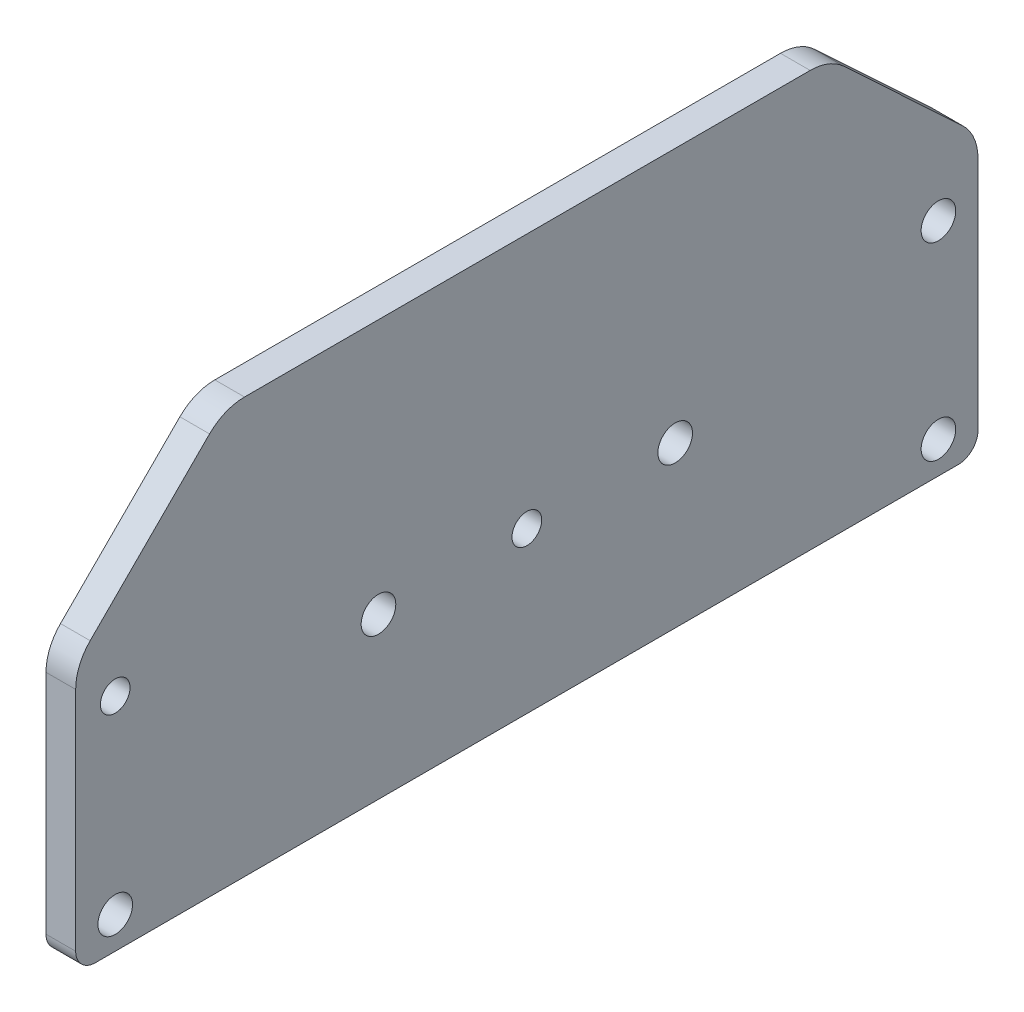
ISO-10303-21;
HEADER;
FILE_DESCRIPTION(('STEP AP214'),'2;1');
FILE_NAME('part.step','',(''),(''),'','','');
FILE_SCHEMA(('AUTOMOTIVE_DESIGN { 1 0 10303 214 1 1 1 1 }'));
ENDSEC;
DATA;
#1=APPLICATION_CONTEXT('core data for automotive mechanical design processes');
#2=APPLICATION_PROTOCOL_DEFINITION('international standard','automotive_design',2000,#1);
#3=PRODUCT_CONTEXT('',#1,'mechanical');
#4=PRODUCT('Part','Part','',(#3));
#5=PRODUCT_RELATED_PRODUCT_CATEGORY('part','',(#4));
#6=PRODUCT_DEFINITION_FORMATION('','',#4);
#7=PRODUCT_DEFINITION_CONTEXT('part definition',#1,'design');
#8=PRODUCT_DEFINITION('design','',#6,#7);
#9=PRODUCT_DEFINITION_SHAPE('','',#8);
#10=(LENGTH_UNIT() NAMED_UNIT(*) SI_UNIT(.MILLI.,.METRE.));
#11=(NAMED_UNIT(*) PLANE_ANGLE_UNIT() SI_UNIT($,.RADIAN.));
#12=(NAMED_UNIT(*) SI_UNIT($,.STERADIAN.) SOLID_ANGLE_UNIT());
#13=UNCERTAINTY_MEASURE_WITH_UNIT(LENGTH_MEASURE(1.E-05),#10,'distance_accuracy_value','');
#14=(GEOMETRIC_REPRESENTATION_CONTEXT(3) GLOBAL_UNCERTAINTY_ASSIGNED_CONTEXT((#13)) GLOBAL_UNIT_ASSIGNED_CONTEXT((#10,
#11,#12)) REPRESENTATION_CONTEXT('',''));
#15=CARTESIAN_POINT('',(0.,0.,0.));
#16=DIRECTION('',(0.,0.,1.));
#17=DIRECTION('',(1.,0.,0.));
#18=AXIS2_PLACEMENT_3D('',#15,#16,#17);
#19=CARTESIAN_POINT('',(30.,20.,-20.));
#20=DIRECTION('',(-1.,0.,0.));
#21=DIRECTION('',(0.,0.,1.));
#22=AXIS2_PLACEMENT_3D('',#19,#20,#21);
#23=CYLINDRICAL_SURFACE('',#22,20.);
#24=CARTESIAN_POINT('',(0.,20.,-20.));
#25=DIRECTION('',(1.,0.,0.));
#26=DIRECTION('',(0.,0.,-1.));
#27=AXIS2_PLACEMENT_3D('',#24,#25,#26);
#28=CIRCLE('',#27,20.);
#29=CARTESIAN_POINT('',(0.,20.0000000000001,0.));
#30=VERTEX_POINT('',#29);
#31=CARTESIAN_POINT('',(0.,0.,-20.0000000000001));
#32=VERTEX_POINT('',#31);
#33=EDGE_CURVE('E201',#30,#32,#28,.T.);
#34=ORIENTED_EDGE('',*,*,#33,.T.);
#35=DIRECTION('',(-1.,0.,0.));
#36=VECTOR('',#35,1.);
#37=CARTESIAN_POINT('',(30.,0.,-20.0000000000001));
#38=LINE('',#37,#36);
#39=CARTESIAN_POINT('',(30.,0.,-20.0000000000001));
#40=VERTEX_POINT('',#39);
#41=EDGE_CURVE('E11',#40,#32,#38,.T.);
#42=ORIENTED_EDGE('',*,*,#41,.F.);
#43=CARTESIAN_POINT('',(30.,20.,-20.));
#44=DIRECTION('',(1.,0.,0.));
#45=DIRECTION('',(0.,0.,-1.));
#46=AXIS2_PLACEMENT_3D('',#43,#44,#45);
#47=CIRCLE('',#46,20.);
#48=CARTESIAN_POINT('',(30.,20.0000000000001,0.));
#49=VERTEX_POINT('',#48);
#50=EDGE_CURVE('E114',#49,#40,#47,.T.);
#51=ORIENTED_EDGE('',*,*,#50,.F.);
#52=DIRECTION('',(-1.,0.,0.));
#53=VECTOR('',#52,1.);
#54=CARTESIAN_POINT('',(30.,20.0000000000001,0.));
#55=LINE('',#54,#53);
#56=EDGE_CURVE('E65',#49,#30,#55,.T.);
#57=ORIENTED_EDGE('',*,*,#56,.T.);
#58=EDGE_LOOP('',(#34,#42,#51,#57));
#59=FACE_BOUND('',#58,.T.);
#60=ADVANCED_FACE('F47',(#59),#23,.T.);
#61=CARTESIAN_POINT('',(30.,0.,0.));
#62=DIRECTION('',(0.,-1.,0.));
#63=DIRECTION('',(0.,0.,-1.));
#64=AXIS2_PLACEMENT_3D('',#61,#62,#63);
#65=PLANE('',#64);
#66=DIRECTION('',(0.,0.,1.));
#67=VECTOR('',#66,1.);
#68=CARTESIAN_POINT('',(0.,0.,0.));
#69=LINE('',#68,#67);
#70=CARTESIAN_POINT('',(0.,-1.00613961606655E-13,-892.32));
#71=VERTEX_POINT('',#70);
#72=EDGE_CURVE('E204',#71,#32,#69,.T.);
#73=ORIENTED_EDGE('',*,*,#72,.F.);
#74=DIRECTION('',(-1.,0.,0.));
#75=VECTOR('',#74,1.);
#76=CARTESIAN_POINT('',(30.,-1.00613961606655E-13,-892.32));
#77=LINE('',#76,#75);
#78=CARTESIAN_POINT('',(30.,-1.00613961606655E-13,-892.32));
#79=VERTEX_POINT('',#78);
#80=EDGE_CURVE('E57',#79,#71,#77,.T.);
#81=ORIENTED_EDGE('',*,*,#80,.F.);
#82=DIRECTION('',(0.,0.,1.));
#83=VECTOR('',#82,1.);
#84=CARTESIAN_POINT('',(30.,0.,0.));
#85=LINE('',#84,#83);
#86=EDGE_CURVE('E300',#79,#40,#85,.T.);
#87=ORIENTED_EDGE('',*,*,#86,.T.);
#88=ORIENTED_EDGE('',*,*,#41,.T.);
#89=EDGE_LOOP('',(#73,#81,#87,#88));
#90=FACE_BOUND('',#89,.T.);
#91=ADVANCED_FACE('F287',(#90),#65,.T.);
#92=CARTESIAN_POINT('',(30.,20.,-892.32));
#93=DIRECTION('',(-1.,0.,0.));
#94=DIRECTION('',(0.,0.,1.));
#95=AXIS2_PLACEMENT_3D('',#92,#93,#94);
#96=CYLINDRICAL_SURFACE('',#95,20.0000000000001);
#97=CARTESIAN_POINT('',(0.,20.,-892.32));
#98=DIRECTION('',(1.,0.,0.));
#99=DIRECTION('',(0.,0.,-1.));
#100=AXIS2_PLACEMENT_3D('',#97,#98,#99);
#101=CIRCLE('',#100,20.0000000000001);
#102=CARTESIAN_POINT('',(0.,20.,-912.32));
#103=VERTEX_POINT('',#102);
#104=EDGE_CURVE('E208',#103,#71,#101,.F.);
#105=ORIENTED_EDGE('',*,*,#104,.F.);
#106=DIRECTION('',(-1.,0.,0.));
#107=VECTOR('',#106,1.);
#108=CARTESIAN_POINT('',(30.,20.,-912.32));
#109=LINE('',#108,#107);
#110=CARTESIAN_POINT('',(30.,20.,-912.32));
#111=VERTEX_POINT('',#110);
#112=EDGE_CURVE('E275',#111,#103,#109,.T.);
#113=ORIENTED_EDGE('',*,*,#112,.F.);
#114=CARTESIAN_POINT('',(30.,20.,-892.32));
#115=DIRECTION('',(1.,0.,0.));
#116=DIRECTION('',(0.,0.,-1.));
#117=AXIS2_PLACEMENT_3D('',#114,#115,#116);
#118=CIRCLE('',#117,20.0000000000001);
#119=EDGE_CURVE('E284',#111,#79,#118,.F.);
#120=ORIENTED_EDGE('',*,*,#119,.T.);
#121=ORIENTED_EDGE('',*,*,#80,.T.);
#122=EDGE_LOOP('',(#105,#113,#120,#121));
#123=FACE_BOUND('',#122,.T.);
#124=ADVANCED_FACE('F282',(#123),#96,.T.);
#125=CARTESIAN_POINT('',(30.,0.,-912.32));
#126=DIRECTION('',(0.,0.,-1.));
#127=DIRECTION('',(-1.,0.,0.));
#128=AXIS2_PLACEMENT_3D('',#125,#126,#127);
#129=PLANE('',#128);
#130=DIRECTION('',(0.,-1.,0.));
#131=VECTOR('',#130,1.);
#132=CARTESIAN_POINT('',(0.,0.,-912.32));
#133=LINE('',#132,#131);
#134=CARTESIAN_POINT('',(0.,258.27238490439,-912.32));
#135=VERTEX_POINT('',#134);
#136=EDGE_CURVE('E212',#135,#103,#133,.T.);
#137=ORIENTED_EDGE('',*,*,#136,.F.);
#138=DIRECTION('',(-1.,0.,0.));
#139=VECTOR('',#138,1.);
#140=CARTESIAN_POINT('',(30.,258.27238490439,-912.32));
#141=LINE('',#140,#139);
#142=CARTESIAN_POINT('',(30.,258.27238490439,-912.32));
#143=VERTEX_POINT('',#142);
#144=EDGE_CURVE('E272',#143,#135,#141,.T.);
#145=ORIENTED_EDGE('',*,*,#144,.F.);
#146=DIRECTION('',(0.,-1.,0.));
#147=VECTOR('',#146,1.);
#148=CARTESIAN_POINT('',(30.,0.,-912.32));
#149=LINE('',#148,#147);
#150=EDGE_CURVE('E297',#143,#111,#149,.T.);
#151=ORIENTED_EDGE('',*,*,#150,.T.);
#152=ORIENTED_EDGE('',*,*,#112,.T.);
#153=EDGE_LOOP('',(#137,#145,#151,#152));
#154=FACE_BOUND('',#153,.T.);
#155=ADVANCED_FACE('F294',(#154),#129,.T.);
#156=CARTESIAN_POINT('',(30.,258.27238490439,-862.32));
#157=DIRECTION('',(-1.,0.,0.));
#158=DIRECTION('',(0.,0.,1.));
#159=AXIS2_PLACEMENT_3D('',#156,#157,#158);
#160=CYLINDRICAL_SURFACE('',#159,50.);
#161=CARTESIAN_POINT('',(0.,258.27238490439,-862.32));
#162=DIRECTION('',(1.,0.,0.));
#163=DIRECTION('',(0.,0.,-1.));
#164=AXIS2_PLACEMENT_3D('',#161,#162,#163);
#165=CIRCLE('',#164,50.);
#166=CARTESIAN_POINT('',(0.,294.825148316533,-896.435912518001));
#167=VERTEX_POINT('',#166);
#168=EDGE_CURVE('E216',#167,#135,#165,.F.);
#169=ORIENTED_EDGE('',*,*,#168,.F.);
#170=DIRECTION('',(-1.,0.,0.));
#171=VECTOR('',#170,1.);
#172=CARTESIAN_POINT('',(30.,294.825148316533,-896.435912518001));
#173=LINE('',#172,#171);
#174=CARTESIAN_POINT('',(30.,294.825148316533,-896.435912518001));
#175=VERTEX_POINT('',#174);
#176=EDGE_CURVE('E269',#175,#167,#173,.T.);
#177=ORIENTED_EDGE('',*,*,#176,.F.);
#178=CARTESIAN_POINT('',(30.,258.27238490439,-862.32));
#179=DIRECTION('',(1.,0.,0.));
#180=DIRECTION('',(0.,0.,-1.));
#181=AXIS2_PLACEMENT_3D('',#178,#179,#180);
#182=CIRCLE('',#181,50.);
#183=EDGE_CURVE('E305',#175,#143,#182,.F.);
#184=ORIENTED_EDGE('',*,*,#183,.T.);
#185=ORIENTED_EDGE('',*,*,#144,.T.);
#186=EDGE_LOOP('',(#169,#177,#184,#185));
#187=FACE_BOUND('',#186,.T.);
#188=ADVANCED_FACE('F538',(#187),#160,.T.);
#189=CARTESIAN_POINT('',(30.,604.720190023753,-564.405510688838));
#190=DIRECTION('',(0.,0.731055268242868,-0.682318250360012));
#191=DIRECTION('',(0.,0.682318250360012,0.731055268242868));
#192=AXIS2_PLACEMENT_3D('',#189,#190,#191);
#193=PLANE('',#192);
#194=DIRECTION('',(0.,-0.682318250360012,-0.731055268242868));
#195=VECTOR('',#194,1.);
#196=CARTESIAN_POINT('',(0.,604.720190023753,-564.405510688838));
#197=LINE('',#196,#195);
#198=CARTESIAN_POINT('',(0.,406.552763412144,-776.727753486989));
#199=VERTEX_POINT('',#198);
#200=EDGE_CURVE('E220',#199,#167,#197,.T.);
#201=ORIENTED_EDGE('',*,*,#200,.F.);
#202=DIRECTION('',(-1.,0.,0.));
#203=VECTOR('',#202,1.);
#204=CARTESIAN_POINT('',(30.,406.552763412144,-776.727753486989));
#205=LINE('',#204,#203);
#206=CARTESIAN_POINT('',(30.,406.552763412144,-776.727753486989));
#207=VERTEX_POINT('',#206);
#208=EDGE_CURVE('E266',#207,#199,#205,.T.);
#209=ORIENTED_EDGE('',*,*,#208,.F.);
#210=DIRECTION('',(0.,-0.682318250360012,-0.731055268242868));
#211=VECTOR('',#210,1.);
#212=CARTESIAN_POINT('',(30.,604.720190023753,-564.405510688838));
#213=LINE('',#212,#211);
#214=EDGE_CURVE('E312',#207,#175,#213,.T.);
#215=ORIENTED_EDGE('',*,*,#214,.T.);
#216=ORIENTED_EDGE('',*,*,#176,.T.);
#217=EDGE_LOOP('',(#201,#209,#215,#216));
#218=FACE_BOUND('',#217,.T.);
#219=ADVANCED_FACE('F529',(#218),#193,.T.);
#220=CARTESIAN_POINT('',(30.,370.000000000001,-742.611840968988));
#221=DIRECTION('',(-1.,0.,0.));
#222=DIRECTION('',(0.,0.,1.));
#223=AXIS2_PLACEMENT_3D('',#220,#221,#222);
#224=CYLINDRICAL_SURFACE('',#223,50.);
#225=CARTESIAN_POINT('',(0.,370.000000000001,-742.611840968988));
#226=DIRECTION('',(1.,0.,0.));
#227=DIRECTION('',(0.,0.,-1.));
#228=AXIS2_PLACEMENT_3D('',#225,#226,#227);
#229=CIRCLE('',#228,50.);
#230=CARTESIAN_POINT('',(0.,420.000000000001,-742.611840968988));
#231=VERTEX_POINT('',#230);
#232=EDGE_CURVE('E224',#231,#199,#229,.F.);
#233=ORIENTED_EDGE('',*,*,#232,.F.);
#234=DIRECTION('',(-1.,0.,0.));
#235=VECTOR('',#234,1.);
#236=CARTESIAN_POINT('',(30.,420.000000000001,-742.611840968988));
#237=LINE('',#236,#235);
#238=CARTESIAN_POINT('',(30.,420.000000000001,-742.611840968988));
#239=VERTEX_POINT('',#238);
#240=EDGE_CURVE('E263',#239,#231,#237,.T.);
#241=ORIENTED_EDGE('',*,*,#240,.F.);
#242=CARTESIAN_POINT('',(30.,370.000000000001,-742.611840968988));
#243=DIRECTION('',(1.,0.,0.));
#244=DIRECTION('',(0.,0.,-1.));
#245=AXIS2_PLACEMENT_3D('',#242,#243,#244);
#246=CIRCLE('',#245,50.);
#247=EDGE_CURVE('E316',#239,#207,#246,.F.);
#248=ORIENTED_EDGE('',*,*,#247,.T.);
#249=ORIENTED_EDGE('',*,*,#208,.T.);
#250=EDGE_LOOP('',(#233,#241,#248,#249));
#251=FACE_BOUND('',#250,.T.);
#252=ADVANCED_FACE('F520',(#251),#224,.T.);
#253=CARTESIAN_POINT('',(30.,420.000000000001,0.));
#254=DIRECTION('',(0.,1.,0.));
#255=DIRECTION('',(0.,0.,1.));
#256=AXIS2_PLACEMENT_3D('',#253,#254,#255);
#257=PLANE('',#256);
#258=DIRECTION('',(0.,0.,-1.));
#259=VECTOR('',#258,1.);
#260=CARTESIAN_POINT('',(0.,420.000000000001,0.));
#261=LINE('',#260,#259);
#262=CARTESIAN_POINT('',(0.,420.000000000001,-170.710678118655));
#263=VERTEX_POINT('',#262);
#264=EDGE_CURVE('E228',#263,#231,#261,.T.);
#265=ORIENTED_EDGE('',*,*,#264,.F.);
#266=DIRECTION('',(-1.,0.,0.));
#267=VECTOR('',#266,1.);
#268=CARTESIAN_POINT('',(30.,420.000000000001,-170.710678118655));
#269=LINE('',#268,#267);
#270=CARTESIAN_POINT('',(30.,420.000000000001,-170.710678118655));
#271=VERTEX_POINT('',#270);
#272=EDGE_CURVE('E260',#271,#263,#269,.T.);
#273=ORIENTED_EDGE('',*,*,#272,.F.);
#274=DIRECTION('',(0.,0.,-1.));
#275=VECTOR('',#274,1.);
#276=CARTESIAN_POINT('',(30.,420.000000000001,0.));
#277=LINE('',#276,#275);
#278=EDGE_CURVE('E320',#271,#239,#277,.T.);
#279=ORIENTED_EDGE('',*,*,#278,.T.);
#280=ORIENTED_EDGE('',*,*,#240,.T.);
#281=EDGE_LOOP('',(#265,#273,#279,#280));
#282=FACE_BOUND('',#281,.T.);
#283=ADVANCED_FACE('F512',(#282),#257,.T.);
#284=CARTESIAN_POINT('',(30.,370.000000000001,-170.710678118655));
#285=DIRECTION('',(-1.,0.,0.));
#286=DIRECTION('',(0.,0.,1.));
#287=AXIS2_PLACEMENT_3D('',#284,#285,#286);
#288=CYLINDRICAL_SURFACE('',#287,50.0000000000001);
#289=CARTESIAN_POINT('',(0.,370.000000000001,-170.710678118655));
#290=DIRECTION('',(1.,0.,0.));
#291=DIRECTION('',(0.,0.,-1.));
#292=AXIS2_PLACEMENT_3D('',#289,#290,#291);
#293=CIRCLE('',#292,50.0000000000001);
#294=CARTESIAN_POINT('',(0.,405.355339059328,-135.355339059327));
#295=VERTEX_POINT('',#294);
#296=EDGE_CURVE('E232',#295,#263,#293,.F.);
#297=ORIENTED_EDGE('',*,*,#296,.F.);
#298=DIRECTION('',(-1.,0.,0.));
#299=VECTOR('',#298,1.);
#300=CARTESIAN_POINT('',(30.,405.355339059328,-135.355339059327));
#301=LINE('',#300,#299);
#302=CARTESIAN_POINT('',(30.,405.355339059328,-135.355339059327));
#303=VERTEX_POINT('',#302);
#304=EDGE_CURVE('E153',#303,#295,#301,.T.);
#305=ORIENTED_EDGE('',*,*,#304,.F.);
#306=CARTESIAN_POINT('',(30.,370.000000000001,-170.710678118655));
#307=DIRECTION('',(1.,0.,0.));
#308=DIRECTION('',(0.,0.,-1.));
#309=AXIS2_PLACEMENT_3D('',#306,#307,#308);
#310=CIRCLE('',#309,50.0000000000001);
#311=EDGE_CURVE('E162',#303,#271,#310,.F.);
#312=ORIENTED_EDGE('',*,*,#311,.T.);
#313=ORIENTED_EDGE('',*,*,#272,.T.);
#314=EDGE_LOOP('',(#297,#305,#312,#313));
#315=FACE_BOUND('',#314,.T.);
#316=ADVANCED_FACE('F326',(#315),#288,.T.);
#317=CARTESIAN_POINT('',(30.,134.999999999999,135.));
#318=DIRECTION('',(0.,0.707106781186546,0.707106781186549));
#319=DIRECTION('',(0.,-0.707106781186549,0.707106781186546));
#320=AXIS2_PLACEMENT_3D('',#317,#318,#319);
#321=PLANE('',#320);
#322=DIRECTION('',(0.,0.707106781186549,-0.707106781186546));
#323=VECTOR('',#322,1.);
#324=CARTESIAN_POINT('',(0.,134.999999999999,135.));
#325=LINE('',#324,#323);
#326=CARTESIAN_POINT('',(0.,284.644660940673,-14.6446609406727));
#327=VERTEX_POINT('',#326);
#328=EDGE_CURVE('E148',#327,#295,#325,.T.);
#329=ORIENTED_EDGE('',*,*,#328,.F.);
#330=DIRECTION('',(-1.,0.,0.));
#331=VECTOR('',#330,1.);
#332=CARTESIAN_POINT('',(30.,284.644660940673,-14.6446609406727));
#333=LINE('',#332,#331);
#334=CARTESIAN_POINT('',(30.,284.644660940673,-14.6446609406727));
#335=VERTEX_POINT('',#334);
#336=EDGE_CURVE('E143',#335,#327,#333,.T.);
#337=ORIENTED_EDGE('',*,*,#336,.F.);
#338=DIRECTION('',(0.,0.707106781186549,-0.707106781186546));
#339=VECTOR('',#338,1.);
#340=CARTESIAN_POINT('',(30.,134.999999999999,135.));
#341=LINE('',#340,#339);
#342=EDGE_CURVE('E146',#335,#303,#341,.T.);
#343=ORIENTED_EDGE('',*,*,#342,.T.);
#344=ORIENTED_EDGE('',*,*,#304,.T.);
#345=EDGE_LOOP('',(#329,#337,#343,#344));
#346=FACE_BOUND('',#345,.T.);
#347=ADVANCED_FACE('F145',(#346),#321,.T.);
#348=CARTESIAN_POINT('',(30.,249.289321881345,-50.));
#349=DIRECTION('',(-1.,0.,0.));
#350=DIRECTION('',(0.,0.,1.));
#351=AXIS2_PLACEMENT_3D('',#348,#349,#350);
#352=CYLINDRICAL_SURFACE('',#351,50.);
#353=CARTESIAN_POINT('',(0.,249.289321881345,-50.));
#354=DIRECTION('',(1.,0.,0.));
#355=DIRECTION('',(0.,0.,-1.));
#356=AXIS2_PLACEMENT_3D('',#353,#354,#355);
#357=CIRCLE('',#356,50.);
#358=CARTESIAN_POINT('',(0.,249.289321881345,0.));
#359=VERTEX_POINT('',#358);
#360=EDGE_CURVE('E238',#359,#327,#357,.F.);
#361=ORIENTED_EDGE('',*,*,#360,.F.);
#362=DIRECTION('',(-1.,0.,0.));
#363=VECTOR('',#362,1.);
#364=CARTESIAN_POINT('',(30.,249.289321881345,0.));
#365=LINE('',#364,#363);
#366=CARTESIAN_POINT('',(30.,249.289321881345,0.));
#367=VERTEX_POINT('',#366);
#368=EDGE_CURVE('E102',#367,#359,#365,.T.);
#369=ORIENTED_EDGE('',*,*,#368,.F.);
#370=CARTESIAN_POINT('',(30.,249.289321881345,-50.));
#371=DIRECTION('',(1.,0.,0.));
#372=DIRECTION('',(0.,0.,-1.));
#373=AXIS2_PLACEMENT_3D('',#370,#371,#372);
#374=CIRCLE('',#373,50.);
#375=EDGE_CURVE('E159',#367,#335,#374,.F.);
#376=ORIENTED_EDGE('',*,*,#375,.T.);
#377=ORIENTED_EDGE('',*,*,#336,.T.);
#378=EDGE_LOOP('',(#361,#369,#376,#377));
#379=FACE_BOUND('',#378,.T.);
#380=ADVANCED_FACE('F165',(#379),#352,.T.);
#381=CARTESIAN_POINT('',(30.,162.057722895832,-306.16));
#382=DIRECTION('',(-1.,0.,0.));
#383=DIRECTION('',(0.,0.,1.));
#384=AXIS2_PLACEMENT_3D('',#381,#382,#383);
#385=CYLINDRICAL_SURFACE('',#384,17.4999999999999);
#386=CARTESIAN_POINT('',(30.,162.057722895832,-306.16));
#387=DIRECTION('',(1.,0.,0.));
#388=DIRECTION('',(0.,0.,-1.));
#389=AXIS2_PLACEMENT_3D('',#386,#387,#388);
#390=CIRCLE('',#389,17.4999999999999);
#391=CARTESIAN_POINT('',(30.,162.057722895832,-323.66));
#392=VERTEX_POINT('',#391);
#393=EDGE_CURVE('E170',#392,#392,#390,.T.);
#394=ORIENTED_EDGE('',*,*,#393,.T.);
#395=EDGE_LOOP('',(#394));
#396=FACE_BOUND('',#395,.T.);
#397=CARTESIAN_POINT('',(0.,162.057722895832,-306.16));
#398=DIRECTION('',(1.,0.,0.));
#399=DIRECTION('',(0.,0.,-1.));
#400=AXIS2_PLACEMENT_3D('',#397,#398,#399);
#401=CIRCLE('',#400,17.4999999999999);
#402=CARTESIAN_POINT('',(0.,162.057722895832,-323.66));
#403=VERTEX_POINT('',#402);
#404=EDGE_CURVE('E245',#403,#403,#401,.T.);
#405=ORIENTED_EDGE('',*,*,#404,.F.);
#406=EDGE_LOOP('',(#405));
#407=FACE_BOUND('',#406,.T.);
#408=ADVANCED_FACE('F331',(#396,#407),#385,.F.);
#409=CARTESIAN_POINT('',(30.,0.,0.));
#410=DIRECTION('',(0.,0.,1.));
#411=DIRECTION('',(1.,0.,0.));
#412=AXIS2_PLACEMENT_3D('',#409,#410,#411);
#413=PLANE('',#412);
#414=DIRECTION('',(0.,1.,0.));
#415=VECTOR('',#414,1.);
#416=CARTESIAN_POINT('',(0.,0.,0.));
#417=LINE('',#416,#415);
#418=EDGE_CURVE('E241',#30,#359,#417,.T.);
#419=ORIENTED_EDGE('',*,*,#418,.F.);
#420=ORIENTED_EDGE('',*,*,#56,.F.);
#421=DIRECTION('',(0.,1.,0.));
#422=VECTOR('',#421,1.);
#423=CARTESIAN_POINT('',(30.,0.,0.));
#424=LINE('',#423,#422);
#425=EDGE_CURVE('E167',#49,#367,#424,.T.);
#426=ORIENTED_EDGE('',*,*,#425,.T.);
#427=ORIENTED_EDGE('',*,*,#368,.T.);
#428=EDGE_LOOP('',(#419,#420,#426,#427));
#429=FACE_BOUND('',#428,.T.);
#430=ADVANCED_FACE('F328',(#429),#413,.T.);
#431=CARTESIAN_POINT('',(30.,162.057722895832,-456.16));
#432=DIRECTION('',(-1.,0.,0.));
#433=DIRECTION('',(0.,0.,1.));
#434=AXIS2_PLACEMENT_3D('',#431,#432,#433);
#435=CYLINDRICAL_SURFACE('',#434,15.);
#436=CARTESIAN_POINT('',(30.,162.057722895832,-456.16));
#437=DIRECTION('',(1.,0.,0.));
#438=DIRECTION('',(0.,0.,-1.));
#439=AXIS2_PLACEMENT_3D('',#436,#437,#438);
#440=CIRCLE('',#439,15.);
#441=CARTESIAN_POINT('',(30.,162.057722895832,-471.16));
#442=VERTEX_POINT('',#441);
#443=EDGE_CURVE('E639',#442,#442,#440,.T.);
#444=ORIENTED_EDGE('',*,*,#443,.T.);
#445=EDGE_LOOP('',(#444));
#446=FACE_BOUND('',#445,.T.);
#447=CARTESIAN_POINT('',(0.,162.057722895832,-456.16));
#448=DIRECTION('',(1.,0.,0.));
#449=DIRECTION('',(0.,0.,-1.));
#450=AXIS2_PLACEMENT_3D('',#447,#448,#449);
#451=CIRCLE('',#450,15.);
#452=CARTESIAN_POINT('',(0.,162.057722895832,-471.16));
#453=VERTEX_POINT('',#452);
#454=EDGE_CURVE('E197',#453,#453,#451,.T.);
#455=ORIENTED_EDGE('',*,*,#454,.F.);
#456=EDGE_LOOP('',(#455));
#457=FACE_BOUND('',#456,.T.);
#458=ADVANCED_FACE('F330',(#446,#457),#435,.F.);
#459=CARTESIAN_POINT('',(30.,223.507722895832,-872.32));
#460=DIRECTION('',(-1.,0.,0.));
#461=DIRECTION('',(0.,0.,1.));
#462=AXIS2_PLACEMENT_3D('',#459,#460,#461);
#463=CYLINDRICAL_SURFACE('',#462,17.4999999999999);
#464=CARTESIAN_POINT('',(30.,223.507722895832,-872.32));
#465=DIRECTION('',(1.,0.,0.));
#466=DIRECTION('',(0.,0.,-1.));
#467=AXIS2_PLACEMENT_3D('',#464,#465,#466);
#468=CIRCLE('',#467,17.4999999999999);
#469=CARTESIAN_POINT('',(30.,223.507722895832,-889.82));
#470=VERTEX_POINT('',#469);
#471=EDGE_CURVE('E636',#470,#470,#468,.T.);
#472=ORIENTED_EDGE('',*,*,#471,.T.);
#473=EDGE_LOOP('',(#472));
#474=FACE_BOUND('',#473,.T.);
#475=CARTESIAN_POINT('',(0.,223.507722895832,-872.32));
#476=DIRECTION('',(1.,0.,0.));
#477=DIRECTION('',(0.,0.,-1.));
#478=AXIS2_PLACEMENT_3D('',#475,#476,#477);
#479=CIRCLE('',#478,17.4999999999999);
#480=CARTESIAN_POINT('',(0.,223.507722895832,-889.82));
#481=VERTEX_POINT('',#480);
#482=EDGE_CURVE('E193',#481,#481,#479,.T.);
#483=ORIENTED_EDGE('',*,*,#482,.F.);
#484=EDGE_LOOP('',(#483));
#485=FACE_BOUND('',#484,.T.);
#486=ADVANCED_FACE('F337',(#474,#485),#463,.F.);
#487=CARTESIAN_POINT('',(30.,162.057722895832,-606.16));
#488=DIRECTION('',(-1.,0.,0.));
#489=DIRECTION('',(0.,0.,1.));
#490=AXIS2_PLACEMENT_3D('',#487,#488,#489);
#491=CYLINDRICAL_SURFACE('',#490,17.4999999999999);
#492=CARTESIAN_POINT('',(30.,162.057722895832,-606.16));
#493=DIRECTION('',(1.,0.,0.));
#494=DIRECTION('',(0.,0.,-1.));
#495=AXIS2_PLACEMENT_3D('',#492,#493,#494);
#496=CIRCLE('',#495,17.4999999999999);
#497=CARTESIAN_POINT('',(30.,162.057722895832,-623.66));
#498=VERTEX_POINT('',#497);
#499=EDGE_CURVE('E632',#498,#498,#496,.T.);
#500=ORIENTED_EDGE('',*,*,#499,.T.);
#501=EDGE_LOOP('',(#500));
#502=FACE_BOUND('',#501,.T.);
#503=CARTESIAN_POINT('',(0.,162.057722895832,-606.16));
#504=DIRECTION('',(1.,0.,0.));
#505=DIRECTION('',(0.,0.,-1.));
#506=AXIS2_PLACEMENT_3D('',#503,#504,#505);
#507=CIRCLE('',#506,17.4999999999999);
#508=CARTESIAN_POINT('',(0.,162.057722895832,-623.66));
#509=VERTEX_POINT('',#508);
#510=EDGE_CURVE('E189',#509,#509,#507,.T.);
#511=ORIENTED_EDGE('',*,*,#510,.F.);
#512=EDGE_LOOP('',(#511));
#513=FACE_BOUND('',#512,.T.);
#514=ADVANCED_FACE('F353',(#502,#513),#491,.F.);
#515=CARTESIAN_POINT('',(30.,223.507722895832,-40.));
#516=DIRECTION('',(-1.,0.,0.));
#517=DIRECTION('',(0.,0.,1.));
#518=AXIS2_PLACEMENT_3D('',#515,#516,#517);
#519=CYLINDRICAL_SURFACE('',#518,15.);
#520=CARTESIAN_POINT('',(30.,223.507722895832,-40.));
#521=DIRECTION('',(1.,0.,0.));
#522=DIRECTION('',(0.,0.,-1.));
#523=AXIS2_PLACEMENT_3D('',#520,#521,#522);
#524=CIRCLE('',#523,15.);
#525=CARTESIAN_POINT('',(30.,223.507722895832,-55.));
#526=VERTEX_POINT('',#525);
#527=EDGE_CURVE('E368',#526,#526,#524,.T.);
#528=ORIENTED_EDGE('',*,*,#527,.T.);
#529=EDGE_LOOP('',(#528));
#530=FACE_BOUND('',#529,.T.);
#531=CARTESIAN_POINT('',(0.,223.507722895832,-40.));
#532=DIRECTION('',(1.,0.,0.));
#533=DIRECTION('',(0.,0.,-1.));
#534=AXIS2_PLACEMENT_3D('',#531,#532,#533);
#535=CIRCLE('',#534,15.);
#536=CARTESIAN_POINT('',(0.,223.507722895832,-55.));
#537=VERTEX_POINT('',#536);
#538=EDGE_CURVE('E185',#537,#537,#535,.T.);
#539=ORIENTED_EDGE('',*,*,#538,.F.);
#540=EDGE_LOOP('',(#539));
#541=FACE_BOUND('',#540,.T.);
#542=ADVANCED_FACE('F356',(#530,#541),#519,.F.);
#543=CARTESIAN_POINT('',(30.,32.2453112680151,-40.));
#544=DIRECTION('',(-1.,0.,0.));
#545=DIRECTION('',(0.,0.,1.));
#546=AXIS2_PLACEMENT_3D('',#543,#544,#545);
#547=CYLINDRICAL_SURFACE('',#546,17.4999999999999);
#548=CARTESIAN_POINT('',(30.,32.2453112680151,-40.));
#549=DIRECTION('',(1.,0.,0.));
#550=DIRECTION('',(0.,0.,-1.));
#551=AXIS2_PLACEMENT_3D('',#548,#549,#550);
#552=CIRCLE('',#551,17.4999999999999);
#553=CARTESIAN_POINT('',(30.,32.2453112680151,-57.5));
#554=VERTEX_POINT('',#553);
#555=EDGE_CURVE('E253',#554,#554,#552,.T.);
#556=ORIENTED_EDGE('',*,*,#555,.T.);
#557=EDGE_LOOP('',(#556));
#558=FACE_BOUND('',#557,.T.);
#559=CARTESIAN_POINT('',(0.,32.2453112680151,-40.));
#560=DIRECTION('',(1.,0.,0.));
#561=DIRECTION('',(0.,0.,-1.));
#562=AXIS2_PLACEMENT_3D('',#559,#560,#561);
#563=CIRCLE('',#562,17.4999999999999);
#564=CARTESIAN_POINT('',(0.,32.2453112680151,-57.5));
#565=VERTEX_POINT('',#564);
#566=EDGE_CURVE('E181',#565,#565,#563,.T.);
#567=ORIENTED_EDGE('',*,*,#566,.F.);
#568=EDGE_LOOP('',(#567));
#569=FACE_BOUND('',#568,.T.);
#570=ADVANCED_FACE('F49',(#558,#569),#547,.F.);
#571=CARTESIAN_POINT('',(30.,32.2453112680149,-872.32));
#572=DIRECTION('',(-1.,0.,0.));
#573=DIRECTION('',(0.,0.,1.));
#574=AXIS2_PLACEMENT_3D('',#571,#572,#573);
#575=CYLINDRICAL_SURFACE('',#574,17.4999999999999);
#576=CARTESIAN_POINT('',(30.,32.2453112680149,-872.32));
#577=DIRECTION('',(1.,0.,0.));
#578=DIRECTION('',(0.,0.,-1.));
#579=AXIS2_PLACEMENT_3D('',#576,#577,#578);
#580=CIRCLE('',#579,17.4999999999999);
#581=CARTESIAN_POINT('',(30.,32.2453112680149,-889.82));
#582=VERTEX_POINT('',#581);
#583=EDGE_CURVE('E177',#582,#582,#580,.T.);
#584=ORIENTED_EDGE('',*,*,#583,.T.);
#585=EDGE_LOOP('',(#584));
#586=FACE_BOUND('',#585,.T.);
#587=CARTESIAN_POINT('',(0.,32.2453112680149,-872.32));
#588=DIRECTION('',(1.,0.,0.));
#589=DIRECTION('',(0.,0.,-1.));
#590=AXIS2_PLACEMENT_3D('',#587,#588,#589);
#591=CIRCLE('',#590,17.4999999999999);
#592=CARTESIAN_POINT('',(0.,32.2453112680149,-889.82));
#593=VERTEX_POINT('',#592);
#594=EDGE_CURVE('E249',#593,#593,#591,.T.);
#595=ORIENTED_EDGE('',*,*,#594,.F.);
#596=EDGE_LOOP('',(#595));
#597=FACE_BOUND('',#596,.T.);
#598=ADVANCED_FACE('F363',(#586,#597),#575,.F.);
#599=CARTESIAN_POINT('',(30.,0.,0.));
#600=DIRECTION('',(1.,0.,0.));
#601=DIRECTION('',(0.,0.,-1.));
#602=AXIS2_PLACEMENT_3D('',#599,#600,#601);
#603=PLANE('',#602);
#604=ORIENTED_EDGE('',*,*,#555,.F.);
#605=EDGE_LOOP('',(#604));
#606=FACE_BOUND('',#605,.T.);
#607=ORIENTED_EDGE('',*,*,#527,.F.);
#608=EDGE_LOOP('',(#607));
#609=FACE_BOUND('',#608,.T.);
#610=ORIENTED_EDGE('',*,*,#499,.F.);
#611=EDGE_LOOP('',(#610));
#612=FACE_BOUND('',#611,.T.);
#613=ORIENTED_EDGE('',*,*,#471,.F.);
#614=EDGE_LOOP('',(#613));
#615=FACE_BOUND('',#614,.T.);
#616=ORIENTED_EDGE('',*,*,#443,.F.);
#617=EDGE_LOOP('',(#616));
#618=FACE_BOUND('',#617,.T.);
#619=ORIENTED_EDGE('',*,*,#50,.T.);
#620=ORIENTED_EDGE('',*,*,#86,.F.);
#621=ORIENTED_EDGE('',*,*,#119,.F.);
#622=ORIENTED_EDGE('',*,*,#150,.F.);
#623=ORIENTED_EDGE('',*,*,#183,.F.);
#624=ORIENTED_EDGE('',*,*,#214,.F.);
#625=ORIENTED_EDGE('',*,*,#247,.F.);
#626=ORIENTED_EDGE('',*,*,#278,.F.);
#627=ORIENTED_EDGE('',*,*,#311,.F.);
#628=ORIENTED_EDGE('',*,*,#342,.F.);
#629=ORIENTED_EDGE('',*,*,#375,.F.);
#630=ORIENTED_EDGE('',*,*,#425,.F.);
#631=EDGE_LOOP('',(#619,#620,#621,#622,#623,#624,#625,#626,#627,#628,#629,#630));
#632=FACE_BOUND('',#631,.T.);
#633=ORIENTED_EDGE('',*,*,#393,.F.);
#634=EDGE_LOOP('',(#633));
#635=FACE_BOUND('',#634,.T.);
#636=ORIENTED_EDGE('',*,*,#583,.F.);
#637=EDGE_LOOP('',(#636));
#638=FACE_BOUND('',#637,.T.);
#639=ADVANCED_FACE('F157',(#606,#609,#612,#615,#618,#632,#635,#638),#603,.T.);
#640=CARTESIAN_POINT('',(0.,0.,0.));
#641=DIRECTION('',(1.,0.,0.));
#642=DIRECTION('',(0.,0.,-1.));
#643=AXIS2_PLACEMENT_3D('',#640,#641,#642);
#644=PLANE('',#643);
#645=ORIENTED_EDGE('',*,*,#566,.T.);
#646=EDGE_LOOP('',(#645));
#647=FACE_BOUND('',#646,.T.);
#648=ORIENTED_EDGE('',*,*,#538,.T.);
#649=EDGE_LOOP('',(#648));
#650=FACE_BOUND('',#649,.T.);
#651=ORIENTED_EDGE('',*,*,#510,.T.);
#652=EDGE_LOOP('',(#651));
#653=FACE_BOUND('',#652,.T.);
#654=ORIENTED_EDGE('',*,*,#482,.T.);
#655=EDGE_LOOP('',(#654));
#656=FACE_BOUND('',#655,.T.);
#657=ORIENTED_EDGE('',*,*,#454,.T.);
#658=EDGE_LOOP('',(#657));
#659=FACE_BOUND('',#658,.T.);
#660=ORIENTED_EDGE('',*,*,#33,.F.);
#661=ORIENTED_EDGE('',*,*,#418,.T.);
#662=ORIENTED_EDGE('',*,*,#360,.T.);
#663=ORIENTED_EDGE('',*,*,#328,.T.);
#664=ORIENTED_EDGE('',*,*,#296,.T.);
#665=ORIENTED_EDGE('',*,*,#264,.T.);
#666=ORIENTED_EDGE('',*,*,#232,.T.);
#667=ORIENTED_EDGE('',*,*,#200,.T.);
#668=ORIENTED_EDGE('',*,*,#168,.T.);
#669=ORIENTED_EDGE('',*,*,#136,.T.);
#670=ORIENTED_EDGE('',*,*,#104,.T.);
#671=ORIENTED_EDGE('',*,*,#72,.T.);
#672=EDGE_LOOP('',(#660,#661,#662,#663,#664,#665,#666,#667,#668,#669,#670,#671));
#673=FACE_BOUND('',#672,.T.);
#674=ORIENTED_EDGE('',*,*,#404,.T.);
#675=EDGE_LOOP('',(#674));
#676=FACE_BOUND('',#675,.T.);
#677=ORIENTED_EDGE('',*,*,#594,.T.);
#678=EDGE_LOOP('',(#677));
#679=FACE_BOUND('',#678,.T.);
#680=ADVANCED_FACE('F289',(#647,#650,#653,#656,#659,#673,#676,#679),#644,.F.);
#681=CLOSED_SHELL('',(#60,#91,#124,#155,#188,#219,#252,#283,#316,#347,#380,#408,#430,#458,#486,
#514,#542,#570,#598,#639,#680));
#682=MANIFOLD_SOLID_BREP('B2',#681);
#683=ADVANCED_BREP_SHAPE_REPRESENTATION('',(#18,#682),#14);
#684=SHAPE_DEFINITION_REPRESENTATION(#9,#683);
ENDSEC;
END-ISO-10303-21;
